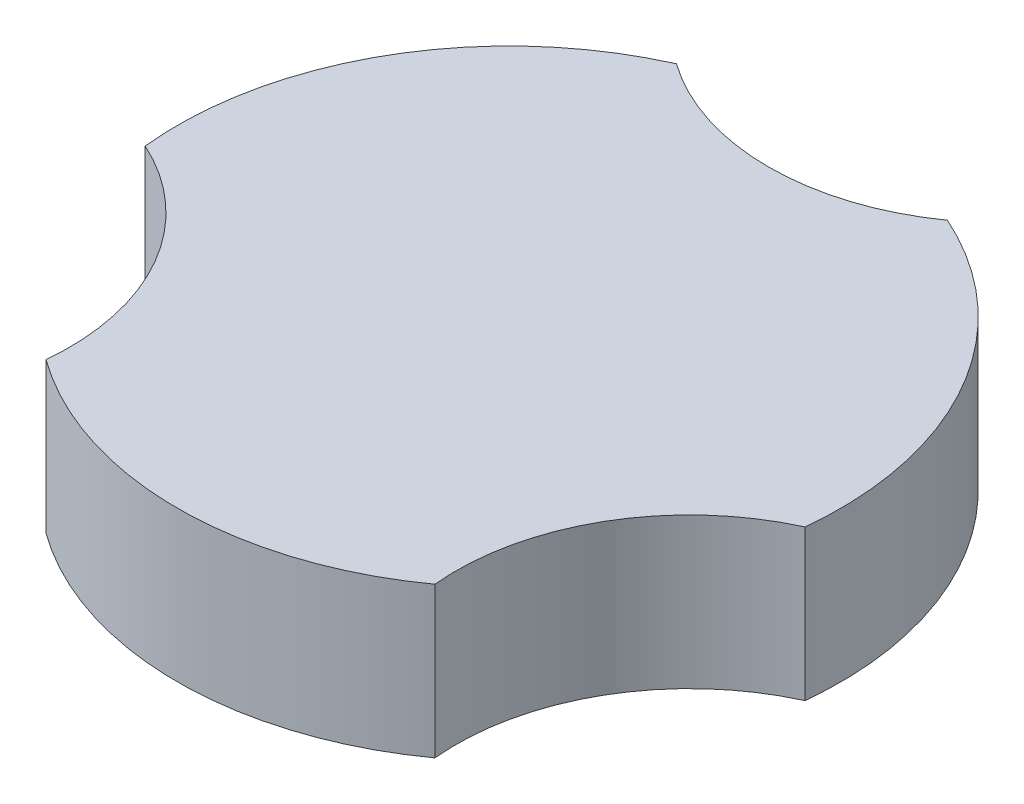
ISO-10303-21;
HEADER;
FILE_DESCRIPTION(('STEP AP214'),'2;1');
FILE_NAME('part.step','',(''),(''),'','','');
FILE_SCHEMA(('AUTOMOTIVE_DESIGN { 1 0 10303 214 1 1 1 1 }'));
ENDSEC;
DATA;
#1=APPLICATION_CONTEXT('core data for automotive mechanical design processes');
#2=APPLICATION_PROTOCOL_DEFINITION('international standard','automotive_design',2000,#1);
#3=PRODUCT_CONTEXT('',#1,'mechanical');
#4=PRODUCT('Part','Part','',(#3));
#5=PRODUCT_RELATED_PRODUCT_CATEGORY('part','',(#4));
#6=PRODUCT_DEFINITION_FORMATION('','',#4);
#7=PRODUCT_DEFINITION_CONTEXT('part definition',#1,'design');
#8=PRODUCT_DEFINITION('design','',#6,#7);
#9=PRODUCT_DEFINITION_SHAPE('','',#8);
#10=(LENGTH_UNIT() NAMED_UNIT(*) SI_UNIT(.MILLI.,.METRE.));
#11=(NAMED_UNIT(*) PLANE_ANGLE_UNIT() SI_UNIT($,.RADIAN.));
#12=(NAMED_UNIT(*) SI_UNIT($,.STERADIAN.) SOLID_ANGLE_UNIT());
#13=UNCERTAINTY_MEASURE_WITH_UNIT(LENGTH_MEASURE(1.E-05),#10,'distance_accuracy_value','');
#14=(GEOMETRIC_REPRESENTATION_CONTEXT(3) GLOBAL_UNCERTAINTY_ASSIGNED_CONTEXT((#13)) GLOBAL_UNIT_ASSIGNED_CONTEXT((#10,
#11,#12)) REPRESENTATION_CONTEXT('',''));
#15=CARTESIAN_POINT('',(0.,0.,0.));
#16=DIRECTION('',(0.,0.,1.));
#17=DIRECTION('',(1.,0.,0.));
#18=AXIS2_PLACEMENT_3D('',#15,#16,#17);
#19=CARTESIAN_POINT('',(-18.0133283987154,6.35,10.4000000000005));
#20=DIRECTION('',(0.,-1.,0.));
#21=DIRECTION('',(0.,0.,-1.));
#22=AXIS2_PLACEMENT_3D('',#19,#20,#21);
#23=CYLINDRICAL_SURFACE('',#22,9.85000000000117);
#24=CARTESIAN_POINT('',(-18.0133283987154,0.,10.4000000000005));
#25=DIRECTION('',(0.,1.,0.));
#26=DIRECTION('',(0.,0.,1.));
#27=AXIS2_PLACEMENT_3D('',#24,#25,#26);
#28=CIRCLE('',#27,9.85000000000117);
#29=CARTESIAN_POINT('',(-8.20839640322222,0.,11.3411740347976));
#30=VERTEX_POINT('',#29);
#31=CARTESIAN_POINT('',(-13.9259430244862,0.,1.43809279212561));
#32=VERTEX_POINT('',#31);
#33=EDGE_CURVE('E124',#30,#32,#28,.T.);
#34=ORIENTED_EDGE('',*,*,#33,.F.);
#35=DIRECTION('',(0.,-1.,0.));
#36=VECTOR('',#35,1.);
#37=CARTESIAN_POINT('',(-8.20839640322222,6.35,11.3411740347976));
#38=LINE('',#37,#36);
#39=CARTESIAN_POINT('',(-8.20839640322222,6.35,11.3411740347976));
#40=VERTEX_POINT('',#39);
#41=EDGE_CURVE('E11',#40,#30,#38,.T.);
#42=ORIENTED_EDGE('',*,*,#41,.F.);
#43=CARTESIAN_POINT('',(-18.0133283987154,6.35,10.4000000000005));
#44=DIRECTION('',(0.,1.,0.));
#45=DIRECTION('',(0.,0.,1.));
#46=AXIS2_PLACEMENT_3D('',#43,#44,#45);
#47=CIRCLE('',#46,9.85000000000117);
#48=CARTESIAN_POINT('',(-13.9259430244862,6.35,1.43809279212561));
#49=VERTEX_POINT('',#48);
#50=EDGE_CURVE('E147',#40,#49,#47,.T.);
#51=ORIENTED_EDGE('',*,*,#50,.T.);
#52=DIRECTION('',(0.,-1.,0.));
#53=VECTOR('',#52,1.);
#54=CARTESIAN_POINT('',(-13.9259430244862,6.35,1.43809279212561));
#55=LINE('',#54,#53);
#56=EDGE_CURVE('E87',#49,#32,#55,.T.);
#57=ORIENTED_EDGE('',*,*,#56,.T.);
#58=EDGE_LOOP('',(#34,#42,#51,#57));
#59=FACE_BOUND('',#58,.T.);
#60=ADVANCED_FACE('F43',(#59),#23,.F.);
#61=CARTESIAN_POINT('',(0.,6.35,0.));
#62=DIRECTION('',(0.,-1.,0.));
#63=DIRECTION('',(0.,0.,-1.));
#64=AXIS2_PLACEMENT_3D('',#61,#62,#63);
#65=CYLINDRICAL_SURFACE('',#64,14.);
#66=CARTESIAN_POINT('',(0.,0.,0.));
#67=DIRECTION('',(0.,1.,0.));
#68=DIRECTION('',(0.,0.,1.));
#69=AXIS2_PLACEMENT_3D('',#66,#67,#68);
#70=CIRCLE('',#69,14.);
#71=CARTESIAN_POINT('',(8.20839640322431,0.,11.3411740347961));
#72=VERTEX_POINT('',#71);
#73=EDGE_CURVE('E127',#30,#72,#70,.T.);
#74=ORIENTED_EDGE('',*,*,#73,.T.);
#75=DIRECTION('',(0.,-1.,0.));
#76=VECTOR('',#75,1.);
#77=CARTESIAN_POINT('',(8.20839640322431,6.35,11.3411740347961));
#78=LINE('',#77,#76);
#79=CARTESIAN_POINT('',(8.20839640322431,6.35,11.3411740347961));
#80=VERTEX_POINT('',#79);
#81=EDGE_CURVE('E51',#80,#72,#78,.T.);
#82=ORIENTED_EDGE('',*,*,#81,.F.);
#83=CARTESIAN_POINT('',(0.,6.35,0.));
#84=DIRECTION('',(0.,1.,0.));
#85=DIRECTION('',(0.,0.,1.));
#86=AXIS2_PLACEMENT_3D('',#83,#84,#85);
#87=CIRCLE('',#86,14.);
#88=EDGE_CURVE('E109',#40,#80,#87,.T.);
#89=ORIENTED_EDGE('',*,*,#88,.F.);
#90=ORIENTED_EDGE('',*,*,#41,.T.);
#91=EDGE_LOOP('',(#74,#82,#89,#90));
#92=FACE_BOUND('',#91,.T.);
#93=ADVANCED_FACE('F144',(#92),#65,.T.);
#94=CARTESIAN_POINT('',(18.0133283987172,6.35,10.3999999999995));
#95=DIRECTION('',(0.,-1.,0.));
#96=DIRECTION('',(0.,0.,-1.));
#97=AXIS2_PLACEMENT_3D('',#94,#95,#96);
#98=CYLINDRICAL_SURFACE('',#97,9.85000000000079);
#99=CARTESIAN_POINT('',(18.0133283987172,0.,10.3999999999995));
#100=DIRECTION('',(0.,1.,0.));
#101=DIRECTION('',(0.,0.,1.));
#102=AXIS2_PLACEMENT_3D('',#99,#100,#101);
#103=CIRCLE('',#102,9.85000000000079);
#104=CARTESIAN_POINT('',(13.9259430244862,0.,1.43809279212582));
#105=VERTEX_POINT('',#104);
#106=EDGE_CURVE('E130',#105,#72,#103,.T.);
#107=ORIENTED_EDGE('',*,*,#106,.F.);
#108=DIRECTION('',(0.,-1.,0.));
#109=VECTOR('',#108,1.);
#110=CARTESIAN_POINT('',(13.9259430244862,6.35,1.43809279212582));
#111=LINE('',#110,#109);
#112=CARTESIAN_POINT('',(13.9259430244862,6.35,1.43809279212582));
#113=VERTEX_POINT('',#112);
#114=EDGE_CURVE('E118',#113,#105,#111,.T.);
#115=ORIENTED_EDGE('',*,*,#114,.F.);
#116=CARTESIAN_POINT('',(18.0133283987172,6.35,10.3999999999995));
#117=DIRECTION('',(0.,1.,0.));
#118=DIRECTION('',(0.,0.,1.));
#119=AXIS2_PLACEMENT_3D('',#116,#117,#118);
#120=CIRCLE('',#119,9.85000000000079);
#121=EDGE_CURVE('E106',#113,#80,#120,.T.);
#122=ORIENTED_EDGE('',*,*,#121,.T.);
#123=ORIENTED_EDGE('',*,*,#81,.T.);
#124=EDGE_LOOP('',(#107,#115,#122,#123));
#125=FACE_BOUND('',#124,.T.);
#126=ADVANCED_FACE('F141',(#125),#98,.F.);
#127=CARTESIAN_POINT('',(5.7175466212619,0.,-12.7792668269231));
#128=VERTEX_POINT('',#127);
#129=EDGE_CURVE('E114',#105,#128,#70,.T.);
#130=ORIENTED_EDGE('',*,*,#129,.T.);
#131=DIRECTION('',(0.,-1.,0.));
#132=VECTOR('',#131,1.);
#133=CARTESIAN_POINT('',(5.7175466212619,6.35,-12.7792668269231));
#134=LINE('',#133,#132);
#135=CARTESIAN_POINT('',(5.7175466212619,6.35,-12.7792668269231));
#136=VERTEX_POINT('',#135);
#137=EDGE_CURVE('E111',#136,#128,#134,.T.);
#138=ORIENTED_EDGE('',*,*,#137,.F.);
#139=EDGE_CURVE('E100',#113,#136,#87,.T.);
#140=ORIENTED_EDGE('',*,*,#139,.F.);
#141=ORIENTED_EDGE('',*,*,#114,.T.);
#142=EDGE_LOOP('',(#130,#138,#140,#141));
#143=FACE_BOUND('',#142,.T.);
#144=ADVANCED_FACE('F112',(#143),#65,.T.);
#145=CARTESIAN_POINT('',(0.,6.35,-20.8));
#146=DIRECTION('',(0.,-1.,0.));
#147=DIRECTION('',(0.,0.,-1.));
#148=AXIS2_PLACEMENT_3D('',#145,#146,#147);
#149=CYLINDRICAL_SURFACE('',#148,9.85);
#150=CARTESIAN_POINT('',(0.,0.,-20.8));
#151=DIRECTION('',(0.,1.,0.));
#152=DIRECTION('',(0.,0.,1.));
#153=AXIS2_PLACEMENT_3D('',#150,#151,#152);
#154=CIRCLE('',#153,9.85);
#155=CARTESIAN_POINT('',(-5.7175466212619,0.,-12.7792668269231));
#156=VERTEX_POINT('',#155);
#157=EDGE_CURVE('E134',#156,#128,#154,.T.);
#158=ORIENTED_EDGE('',*,*,#157,.F.);
#159=DIRECTION('',(0.,-1.,0.));
#160=VECTOR('',#159,1.);
#161=CARTESIAN_POINT('',(-5.7175466212619,6.35,-12.7792668269231));
#162=LINE('',#161,#160);
#163=CARTESIAN_POINT('',(-5.7175466212619,6.35,-12.7792668269231));
#164=VERTEX_POINT('',#163);
#165=EDGE_CURVE('E80',#164,#156,#162,.T.);
#166=ORIENTED_EDGE('',*,*,#165,.F.);
#167=CARTESIAN_POINT('',(0.,6.35,-20.8));
#168=DIRECTION('',(0.,1.,0.));
#169=DIRECTION('',(0.,0.,1.));
#170=AXIS2_PLACEMENT_3D('',#167,#168,#169);
#171=CIRCLE('',#170,9.85);
#172=EDGE_CURVE('E104',#164,#136,#171,.T.);
#173=ORIENTED_EDGE('',*,*,#172,.T.);
#174=ORIENTED_EDGE('',*,*,#137,.T.);
#175=EDGE_LOOP('',(#158,#166,#173,#174));
#176=FACE_BOUND('',#175,.T.);
#177=ADVANCED_FACE('F120',(#176),#149,.F.);
#178=EDGE_CURVE('E131',#156,#32,#70,.T.);
#179=ORIENTED_EDGE('',*,*,#178,.T.);
#180=ORIENTED_EDGE('',*,*,#56,.F.);
#181=EDGE_CURVE('E59',#164,#49,#87,.T.);
#182=ORIENTED_EDGE('',*,*,#181,.F.);
#183=ORIENTED_EDGE('',*,*,#165,.T.);
#184=EDGE_LOOP('',(#179,#180,#182,#183));
#185=FACE_BOUND('',#184,.T.);
#186=ADVANCED_FACE('F154',(#185),#65,.T.);
#187=CARTESIAN_POINT('',(0.,6.35,0.));
#188=DIRECTION('',(0.,1.,0.));
#189=DIRECTION('',(0.,0.,1.));
#190=AXIS2_PLACEMENT_3D('',#187,#188,#189);
#191=PLANE('',#190);
#192=ORIENTED_EDGE('',*,*,#50,.F.);
#193=ORIENTED_EDGE('',*,*,#88,.T.);
#194=ORIENTED_EDGE('',*,*,#121,.F.);
#195=ORIENTED_EDGE('',*,*,#139,.T.);
#196=ORIENTED_EDGE('',*,*,#172,.F.);
#197=ORIENTED_EDGE('',*,*,#181,.T.);
#198=EDGE_LOOP('',(#192,#193,#194,#195,#196,#197));
#199=FACE_BOUND('',#198,.T.);
#200=ADVANCED_FACE('F102',(#199),#191,.T.);
#201=CARTESIAN_POINT('',(0.,0.,0.));
#202=DIRECTION('',(0.,1.,0.));
#203=DIRECTION('',(0.,0.,1.));
#204=AXIS2_PLACEMENT_3D('',#201,#202,#203);
#205=PLANE('',#204);
#206=ORIENTED_EDGE('',*,*,#33,.T.);
#207=ORIENTED_EDGE('',*,*,#178,.F.);
#208=ORIENTED_EDGE('',*,*,#157,.T.);
#209=ORIENTED_EDGE('',*,*,#129,.F.);
#210=ORIENTED_EDGE('',*,*,#106,.T.);
#211=ORIENTED_EDGE('',*,*,#73,.F.);
#212=EDGE_LOOP('',(#206,#207,#208,#209,#210,#211));
#213=FACE_BOUND('',#212,.T.);
#214=ADVANCED_FACE('F146',(#213),#205,.F.);
#215=CLOSED_SHELL('',(#60,#93,#126,#144,#177,#186,#200,#214));
#216=MANIFOLD_SOLID_BREP('B2',#215);
#217=ADVANCED_BREP_SHAPE_REPRESENTATION('',(#18,#216),#14);
#218=SHAPE_DEFINITION_REPRESENTATION(#9,#217);
ENDSEC;
END-ISO-10303-21;
